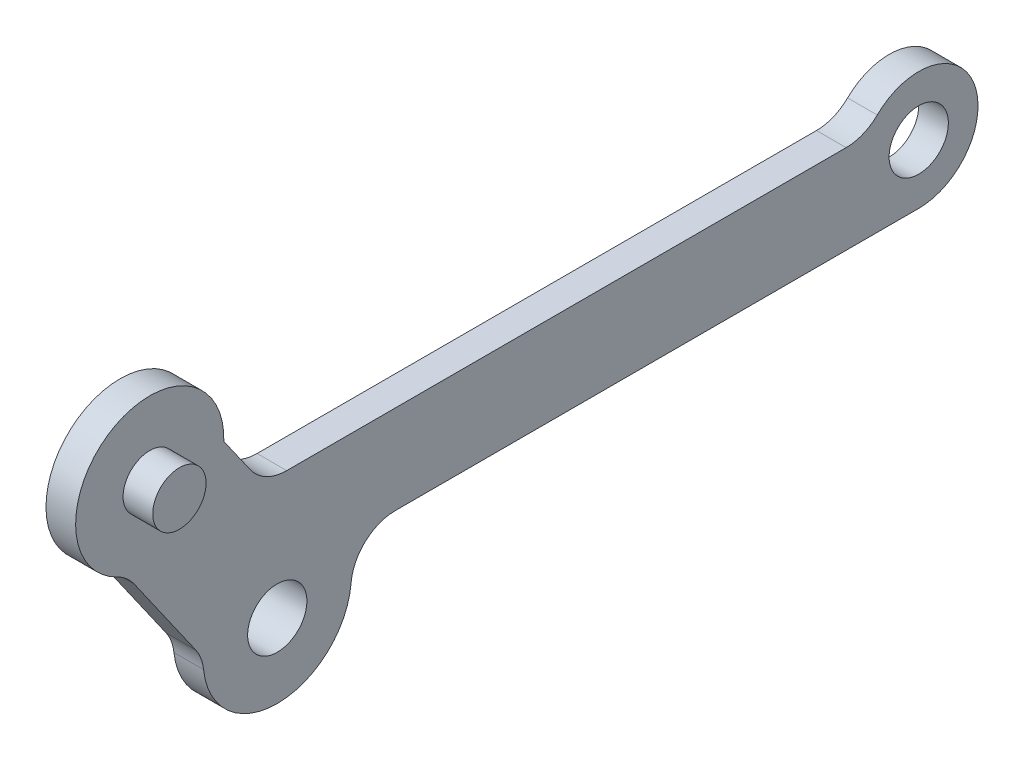
ISO-10303-21;
HEADER;
FILE_DESCRIPTION(('STEP AP214'),'2;1');
FILE_NAME('part.step','',(''),(''),'','','');
FILE_SCHEMA(('AUTOMOTIVE_DESIGN { 1 0 10303 214 1 1 1 1 }'));
ENDSEC;
DATA;
#1=APPLICATION_CONTEXT('core data for automotive mechanical design processes');
#2=APPLICATION_PROTOCOL_DEFINITION('international standard','automotive_design',2000,#1);
#3=PRODUCT_CONTEXT('',#1,'mechanical');
#4=PRODUCT('Part','Part','',(#3));
#5=PRODUCT_RELATED_PRODUCT_CATEGORY('part','',(#4));
#6=PRODUCT_DEFINITION_FORMATION('','',#4);
#7=PRODUCT_DEFINITION_CONTEXT('part definition',#1,'design');
#8=PRODUCT_DEFINITION('design','',#6,#7);
#9=PRODUCT_DEFINITION_SHAPE('','',#8);
#10=(LENGTH_UNIT() NAMED_UNIT(*) SI_UNIT(.MILLI.,.METRE.));
#11=(NAMED_UNIT(*) PLANE_ANGLE_UNIT() SI_UNIT($,.RADIAN.));
#12=(NAMED_UNIT(*) SI_UNIT($,.STERADIAN.) SOLID_ANGLE_UNIT());
#13=UNCERTAINTY_MEASURE_WITH_UNIT(LENGTH_MEASURE(1.E-05),#10,'distance_accuracy_value','');
#14=(GEOMETRIC_REPRESENTATION_CONTEXT(3) GLOBAL_UNCERTAINTY_ASSIGNED_CONTEXT((#13)) GLOBAL_UNIT_ASSIGNED_CONTEXT((#10,
#11,#12)) REPRESENTATION_CONTEXT('',''));
#15=CARTESIAN_POINT('',(0.,0.,0.));
#16=DIRECTION('',(0.,0.,1.));
#17=DIRECTION('',(1.,0.,0.));
#18=AXIS2_PLACEMENT_3D('',#15,#16,#17);
#19=CARTESIAN_POINT('',(2.,0.,0.));
#20=DIRECTION('',(0.,1.,0.));
#21=DIRECTION('',(0.,0.,1.));
#22=AXIS2_PLACEMENT_3D('',#19,#20,#21);
#23=PLANE('',#22);
#24=DIRECTION('',(0.,0.,-1.));
#25=VECTOR('',#24,1.);
#26=CARTESIAN_POINT('',(2.,0.,0.));
#27=LINE('',#26,#25);
#28=CARTESIAN_POINT('',(2.,0.,-1.56170115165524));
#29=VERTEX_POINT('',#28);
#30=CARTESIAN_POINT('',(2.,0.,-39.3022657436919));
#31=VERTEX_POINT('',#30);
#32=EDGE_CURVE('E237',#29,#31,#27,.T.);
#33=ORIENTED_EDGE('',*,*,#32,.T.);
#34=DIRECTION('',(-1.,0.,0.));
#35=VECTOR('',#34,1.);
#36=CARTESIAN_POINT('',(2.,0.,-39.3022657436919));
#37=LINE('',#36,#35);
#38=CARTESIAN_POINT('',(0.,0.,-39.3022657436919));
#39=VERTEX_POINT('',#38);
#40=EDGE_CURVE('E266',#31,#39,#37,.T.);
#41=ORIENTED_EDGE('',*,*,#40,.T.);
#42=DIRECTION('',(0.,0.,-1.));
#43=VECTOR('',#42,1.);
#44=CARTESIAN_POINT('',(0.,0.,0.));
#45=LINE('',#44,#43);
#46=CARTESIAN_POINT('',(0.,0.,-1.56170115165524));
#47=VERTEX_POINT('',#46);
#48=EDGE_CURVE('E263',#47,#39,#45,.T.);
#49=ORIENTED_EDGE('',*,*,#48,.F.);
#50=DIRECTION('',(-1.,0.,0.));
#51=VECTOR('',#50,1.);
#52=CARTESIAN_POINT('',(2.,0.,-1.56170115165524));
#53=LINE('',#52,#51);
#54=EDGE_CURVE('E246',#47,#29,#53,.F.);
#55=ORIENTED_EDGE('',*,*,#54,.T.);
#56=EDGE_LOOP('',(#33,#41,#49,#55));
#57=FACE_BOUND('',#56,.T.);
#58=ADVANCED_FACE('F136',(#57),#23,.T.);
#59=CARTESIAN_POINT('',(2.,-6.,0.));
#60=DIRECTION('',(0.,1.,0.));
#61=DIRECTION('',(0.,0.,1.));
#62=AXIS2_PLACEMENT_3D('',#59,#60,#61);
#63=PLANE('',#62);
#64=DIRECTION('',(0.,0.,-1.));
#65=VECTOR('',#64,1.);
#66=CARTESIAN_POINT('',(2.,-6.,0.));
#67=LINE('',#66,#65);
#68=CARTESIAN_POINT('',(2.,-6.,-8.89345099264765));
#69=VERTEX_POINT('',#68);
#70=CARTESIAN_POINT('',(2.,-6.,-44.2012452292583));
#71=VERTEX_POINT('',#70);
#72=EDGE_CURVE('E224',#69,#71,#67,.T.);
#73=ORIENTED_EDGE('',*,*,#72,.F.);
#74=DIRECTION('',(1.,0.,0.));
#75=VECTOR('',#74,1.);
#76=CARTESIAN_POINT('',(0.,-6.,-8.89345099264765));
#77=LINE('',#76,#75);
#78=CARTESIAN_POINT('',(0.,-6.,-8.89345099264765));
#79=VERTEX_POINT('',#78);
#80=EDGE_CURVE('E282',#69,#79,#77,.F.);
#81=ORIENTED_EDGE('',*,*,#80,.T.);
#82=DIRECTION('',(0.,0.,-1.));
#83=VECTOR('',#82,1.);
#84=CARTESIAN_POINT('',(0.,-6.,0.));
#85=LINE('',#84,#83);
#86=CARTESIAN_POINT('',(0.,-6.,-44.2012452292583));
#87=VERTEX_POINT('',#86);
#88=EDGE_CURVE('E242',#79,#87,#85,.T.);
#89=ORIENTED_EDGE('',*,*,#88,.T.);
#90=DIRECTION('',(-1.,0.,0.));
#91=VECTOR('',#90,1.);
#92=CARTESIAN_POINT('',(2.,-6.,-44.2012452292583));
#93=LINE('',#92,#91);
#94=EDGE_CURVE('E236',#71,#87,#93,.T.);
#95=ORIENTED_EDGE('',*,*,#94,.F.);
#96=EDGE_LOOP('',(#73,#81,#89,#95));
#97=FACE_BOUND('',#96,.T.);
#98=ADVANCED_FACE('F240',(#97),#63,.F.);
#99=CARTESIAN_POINT('',(0.,0.,0.));
#100=DIRECTION('',(1.,0.,0.));
#101=DIRECTION('',(0.,0.,-1.));
#102=AXIS2_PLACEMENT_3D('',#99,#100,#101);
#103=PLANE('',#102);
#104=CARTESIAN_POINT('',(0.,-2.,-44.2012452292583));
#105=DIRECTION('',(1.,0.,0.));
#106=DIRECTION('',(0.,0.,-1.));
#107=AXIS2_PLACEMENT_3D('',#104,#105,#106);
#108=CIRCLE('',#107,2.);
#109=CARTESIAN_POINT('',(0.,-2.,-46.2012452292583));
#110=VERTEX_POINT('',#109);
#111=EDGE_CURVE('E498',#110,#110,#108,.F.);
#112=ORIENTED_EDGE('',*,*,#111,.F.);
#113=EDGE_LOOP('',(#112));
#114=FACE_BOUND('',#113,.T.);
#115=CARTESIAN_POINT('',(0.,-8.29430574540418,-0.924637052102279));
#116=DIRECTION('',(1.,0.,0.));
#117=DIRECTION('',(0.,0.,-1.));
#118=AXIS2_PLACEMENT_3D('',#115,#116,#117);
#119=CIRCLE('',#118,3.);
#120=CARTESIAN_POINT('',(0.,-8.29430574540418,-3.92463705210228));
#121=VERTEX_POINT('',#120);
#122=EDGE_CURVE('E495',#121,#121,#119,.T.);
#123=ORIENTED_EDGE('',*,*,#122,.T.);
#124=EDGE_LOOP('',(#123));
#125=FACE_BOUND('',#124,.T.);
#126=DIRECTION('',(0.,-0.819152044288992,-0.573576436351045));
#127=VECTOR('',#126,1.);
#128=CARTESIAN_POINT('',(0.,6.28728066433489,4.40240131600742));
#129=LINE('',#128,#127);
#130=CARTESIAN_POINT('',(0.,3.82982453146792,2.6816720069543));
#131=VERTEX_POINT('',#130);
#132=CARTESIAN_POINT('',(0.,1.27927069094687,0.895754981211733));
#133=VERTEX_POINT('',#132);
#134=EDGE_CURVE('E307',#131,#133,#129,.T.);
#135=ORIENTED_EDGE('',*,*,#134,.T.);
#136=CARTESIAN_POINT('',(0.,3.,-1.56170115165524));
#137=DIRECTION('',(1.,0.,0.));
#138=DIRECTION('',(0.,0.,-1.));
#139=AXIS2_PLACEMENT_3D('',#136,#137,#138);
#140=CIRCLE('',#139,3.);
#141=EDGE_CURVE('E144',#133,#47,#140,.T.);
#142=ORIENTED_EDGE('',*,*,#141,.T.);
#143=ORIENTED_EDGE('',*,*,#48,.T.);
#144=CARTESIAN_POINT('',(0.,3.,-39.3022657436919));
#145=DIRECTION('',(1.,0.,0.));
#146=DIRECTION('',(0.,0.,-1.));
#147=AXIS2_PLACEMENT_3D('',#144,#145,#146);
#148=CIRCLE('',#147,3.);
#149=CARTESIAN_POINT('',(0.,0.857142857142855,-41.4018283803632));
#150=VERTEX_POINT('',#149);
#151=EDGE_CURVE('E286',#39,#150,#148,.T.);
#152=ORIENTED_EDGE('',*,*,#151,.T.);
#153=CARTESIAN_POINT('',(0.,-2.,-44.2012452292583));
#154=DIRECTION('',(1.,0.,0.));
#155=DIRECTION('',(0.,0.,-1.));
#156=AXIS2_PLACEMENT_3D('',#153,#154,#155);
#157=CIRCLE('',#156,3.99999999999999);
#158=EDGE_CURVE('E252',#87,#150,#157,.T.);
#159=ORIENTED_EDGE('',*,*,#158,.F.);
#160=ORIENTED_EDGE('',*,*,#88,.F.);
#161=CARTESIAN_POINT('',(0.,-9.,-8.89345099264765));
#162=DIRECTION('',(1.,0.,0.));
#163=DIRECTION('',(0.,0.,-1.));
#164=AXIS2_PLACEMENT_3D('',#161,#162,#163);
#165=CIRCLE('',#164,3.);
#166=CARTESIAN_POINT('',(0.,-8.73536465452657,-5.90514576494314));
#167=VERTEX_POINT('',#166);
#168=EDGE_CURVE('E298',#79,#167,#165,.T.);
#169=ORIENTED_EDGE('',*,*,#168,.T.);
#170=CARTESIAN_POINT('',(0.,-8.29430574540418,-0.924637052102279));
#171=DIRECTION('',(1.,0.,0.));
#172=DIRECTION('',(0.,0.,-1.));
#173=AXIS2_PLACEMENT_3D('',#170,#171,#172);
#174=CIRCLE('',#173,4.99999999999999);
#175=CARTESIAN_POINT('',(0.,-8.82085126347562,4.04756063276493));
#176=VERTEX_POINT('',#175);
#177=EDGE_CURVE('E251',#176,#167,#174,.T.);
#178=ORIENTED_EDGE('',*,*,#177,.F.);
#179=CARTESIAN_POINT('',(0.,-9.13677857431849,7.03087924368525));
#180=DIRECTION('',(1.,0.,0.));
#181=DIRECTION('',(0.,0.,-1.));
#182=AXIS2_PLACEMENT_3D('',#179,#180,#181);
#183=CIRCLE('',#182,3.);
#184=CARTESIAN_POINT('',(0.,-7.41604926526535,4.57342311081828));
#185=VERTEX_POINT('',#184);
#186=EDGE_CURVE('E290',#176,#185,#183,.T.);
#187=ORIENTED_EDGE('',*,*,#186,.T.);
#188=DIRECTION('',(0.,-0.819152044288993,-0.573576436351045));
#189=VECTOR('',#188,1.);
#190=CARTESIAN_POINT('',(0.,1.69866917352653,10.9556176703194));
#191=LINE('',#190,#189);
#192=CARTESIAN_POINT('',(0.,-1.47389305201649,8.73416568455478));
#193=VERTEX_POINT('',#192);
#194=EDGE_CURVE('E318',#193,#185,#191,.T.);
#195=ORIENTED_EDGE('',*,*,#194,.F.);
#196=CARTESIAN_POINT('',(0.,-3.19462236106962,11.1916218174218));
#197=DIRECTION('',(1.,0.,0.));
#198=DIRECTION('',(0.,0.,-1.));
#199=AXIS2_PLACEMENT_3D('',#196,#197,#198);
#200=CIRCLE('',#199,3.);
#201=CARTESIAN_POINT('',(0.,-0.499273381069496,9.87439219582487));
#202=VERTEX_POINT('',#201);
#203=EDGE_CURVE('E294',#193,#202,#200,.T.);
#204=ORIENTED_EDGE('',*,*,#203,.T.);
#205=CARTESIAN_POINT('',(0.,3.99297491893071,7.67900949316339));
#206=DIRECTION('',(1.,0.,0.));
#207=DIRECTION('',(0.,0.,-1.));
#208=AXIS2_PLACEMENT_3D('',#205,#206,#207);
#209=CIRCLE('',#208,4.99999999999999);
#210=EDGE_CURVE('E321',#131,#202,#209,.T.);
#211=ORIENTED_EDGE('',*,*,#210,.F.);
#212=EDGE_LOOP('',(#135,#142,#143,#152,#159,#160,#169,#178,#187,#195,#204,#211));
#213=FACE_BOUND('',#212,.T.);
#214=ADVANCED_FACE('F304',(#114,#125,#213),#103,.F.);
#215=CARTESIAN_POINT('',(2.,0.,0.));
#216=DIRECTION('',(1.,0.,0.));
#217=DIRECTION('',(0.,0.,-1.));
#218=AXIS2_PLACEMENT_3D('',#215,#216,#217);
#219=PLANE('',#218);
#220=CARTESIAN_POINT('',(2.,3.99297491893071,7.67900949316339));
#221=DIRECTION('',(1.,0.,0.));
#222=DIRECTION('',(0.,0.,-1.));
#223=AXIS2_PLACEMENT_3D('',#220,#221,#222);
#224=CIRCLE('',#223,1.8);
#225=CARTESIAN_POINT('',(2.,3.99297491893071,5.87900949316339));
#226=VERTEX_POINT('',#225);
#227=EDGE_CURVE('E511',#226,#226,#224,.T.);
#228=ORIENTED_EDGE('',*,*,#227,.F.);
#229=EDGE_LOOP('',(#228));
#230=FACE_BOUND('',#229,.T.);
#231=CARTESIAN_POINT('',(2.,-8.29430574540418,-0.924637052102279));
#232=DIRECTION('',(1.,0.,0.));
#233=DIRECTION('',(0.,0.,-1.));
#234=AXIS2_PLACEMENT_3D('',#231,#232,#233);
#235=CIRCLE('',#234,2.);
#236=CARTESIAN_POINT('',(2.,-8.29430574540418,-2.92463705210228));
#237=VERTEX_POINT('',#236);
#238=EDGE_CURVE('E506',#237,#237,#235,.T.);
#239=ORIENTED_EDGE('',*,*,#238,.F.);
#240=EDGE_LOOP('',(#239));
#241=FACE_BOUND('',#240,.T.);
#242=CARTESIAN_POINT('',(2.,-2.,-44.2012452292583));
#243=DIRECTION('',(1.,0.,0.));
#244=DIRECTION('',(0.,0.,-1.));
#245=AXIS2_PLACEMENT_3D('',#242,#243,#244);
#246=CIRCLE('',#245,2.);
#247=CARTESIAN_POINT('',(2.,-2.,-46.2012452292583));
#248=VERTEX_POINT('',#247);
#249=EDGE_CURVE('E503',#248,#248,#246,.T.);
#250=ORIENTED_EDGE('',*,*,#249,.F.);
#251=EDGE_LOOP('',(#250));
#252=FACE_BOUND('',#251,.T.);
#253=CARTESIAN_POINT('',(2.,-8.29430574540418,-0.924637052102279));
#254=DIRECTION('',(1.,0.,0.));
#255=DIRECTION('',(0.,0.,-1.));
#256=AXIS2_PLACEMENT_3D('',#253,#254,#255);
#257=CIRCLE('',#256,4.99999999999999);
#258=CARTESIAN_POINT('',(2.,-8.82085126347562,4.04756063276493));
#259=VERTEX_POINT('',#258);
#260=CARTESIAN_POINT('',(2.,-8.73536465452657,-5.90514576494314));
#261=VERTEX_POINT('',#260);
#262=EDGE_CURVE('E255',#259,#261,#257,.T.);
#263=ORIENTED_EDGE('',*,*,#262,.T.);
#264=CARTESIAN_POINT('',(2.,-9.,-8.89345099264765));
#265=DIRECTION('',(1.,0.,0.));
#266=DIRECTION('',(0.,0.,-1.));
#267=AXIS2_PLACEMENT_3D('',#264,#265,#266);
#268=CIRCLE('',#267,3.);
#269=EDGE_CURVE('E232',#261,#69,#268,.F.);
#270=ORIENTED_EDGE('',*,*,#269,.T.);
#271=ORIENTED_EDGE('',*,*,#72,.T.);
#272=CARTESIAN_POINT('',(2.,-2.,-44.2012452292583));
#273=DIRECTION('',(1.,0.,0.));
#274=DIRECTION('',(0.,0.,-1.));
#275=AXIS2_PLACEMENT_3D('',#272,#273,#274);
#276=CIRCLE('',#275,3.99999999999999);
#277=CARTESIAN_POINT('',(2.,0.857142857142855,-41.4018283803632));
#278=VERTEX_POINT('',#277);
#279=EDGE_CURVE('E229',#71,#278,#276,.T.);
#280=ORIENTED_EDGE('',*,*,#279,.T.);
#281=CARTESIAN_POINT('',(2.,3.,-39.3022657436919));
#282=DIRECTION('',(1.,0.,0.));
#283=DIRECTION('',(0.,0.,-1.));
#284=AXIS2_PLACEMENT_3D('',#281,#282,#283);
#285=CIRCLE('',#284,3.);
#286=EDGE_CURVE('E288',#278,#31,#285,.F.);
#287=ORIENTED_EDGE('',*,*,#286,.T.);
#288=ORIENTED_EDGE('',*,*,#32,.F.);
#289=CARTESIAN_POINT('',(2.,3.,-1.56170115165524));
#290=DIRECTION('',(1.,0.,0.));
#291=DIRECTION('',(0.,0.,-1.));
#292=AXIS2_PLACEMENT_3D('',#289,#290,#291);
#293=CIRCLE('',#292,3.);
#294=CARTESIAN_POINT('',(2.,1.27927069094687,0.895754981211733));
#295=VERTEX_POINT('',#294);
#296=EDGE_CURVE('E12',#29,#295,#293,.F.);
#297=ORIENTED_EDGE('',*,*,#296,.T.);
#298=DIRECTION('',(0.,-0.819152044288992,-0.573576436351045));
#299=VECTOR('',#298,1.);
#300=CARTESIAN_POINT('',(2.,6.28728066433489,4.40240131600742));
#301=LINE('',#300,#299);
#302=CARTESIAN_POINT('',(2.,3.82982453146792,2.6816720069543));
#303=VERTEX_POINT('',#302);
#304=EDGE_CURVE('E314',#303,#295,#301,.T.);
#305=ORIENTED_EDGE('',*,*,#304,.F.);
#306=CARTESIAN_POINT('',(2.,3.99297491893071,7.67900949316339));
#307=DIRECTION('',(1.,0.,0.));
#308=DIRECTION('',(0.,0.,-1.));
#309=AXIS2_PLACEMENT_3D('',#306,#307,#308);
#310=CIRCLE('',#309,4.99999999999999);
#311=CARTESIAN_POINT('',(2.,-0.499273381069496,9.87439219582487));
#312=VERTEX_POINT('',#311);
#313=EDGE_CURVE('E264',#303,#312,#310,.T.);
#314=ORIENTED_EDGE('',*,*,#313,.T.);
#315=CARTESIAN_POINT('',(2.,-3.19462236106962,11.1916218174218));
#316=DIRECTION('',(1.,0.,0.));
#317=DIRECTION('',(0.,0.,-1.));
#318=AXIS2_PLACEMENT_3D('',#315,#316,#317);
#319=CIRCLE('',#318,3.);
#320=CARTESIAN_POINT('',(2.,-1.47389305201649,8.73416568455478));
#321=VERTEX_POINT('',#320);
#322=EDGE_CURVE('E296',#312,#321,#319,.F.);
#323=ORIENTED_EDGE('',*,*,#322,.T.);
#324=DIRECTION('',(0.,-0.819152044288993,-0.573576436351045));
#325=VECTOR('',#324,1.);
#326=CARTESIAN_POINT('',(2.,1.69866917352653,10.9556176703194));
#327=LINE('',#326,#325);
#328=CARTESIAN_POINT('',(2.,-7.41604926526535,4.57342311081828));
#329=VERTEX_POINT('',#328);
#330=EDGE_CURVE('E317',#321,#329,#327,.T.);
#331=ORIENTED_EDGE('',*,*,#330,.T.);
#332=CARTESIAN_POINT('',(2.,-9.13677857431849,7.03087924368525));
#333=DIRECTION('',(1.,0.,0.));
#334=DIRECTION('',(0.,0.,-1.));
#335=AXIS2_PLACEMENT_3D('',#332,#333,#334);
#336=CIRCLE('',#335,3.);
#337=EDGE_CURVE('E292',#329,#259,#336,.F.);
#338=ORIENTED_EDGE('',*,*,#337,.T.);
#339=EDGE_LOOP('',(#263,#270,#271,#280,#287,#288,#297,#305,#314,#323,#331,#338));
#340=FACE_BOUND('',#339,.T.);
#341=ADVANCED_FACE('F227',(#230,#241,#252,#340),#219,.T.);
#342=CARTESIAN_POINT('',(2.,-2.,-44.2012452292583));
#343=DIRECTION('',(-1.,0.,0.));
#344=DIRECTION('',(0.,0.,1.));
#345=AXIS2_PLACEMENT_3D('',#342,#343,#344);
#346=CYLINDRICAL_SURFACE('',#345,3.99999999999999);
#347=ORIENTED_EDGE('',*,*,#158,.T.);
#348=DIRECTION('',(-1.,0.,0.));
#349=VECTOR('',#348,1.);
#350=CARTESIAN_POINT('',(2.,0.857142857142855,-41.4018283803632));
#351=LINE('',#350,#349);
#352=EDGE_CURVE('E250',#150,#278,#351,.F.);
#353=ORIENTED_EDGE('',*,*,#352,.T.);
#354=ORIENTED_EDGE('',*,*,#279,.F.);
#355=ORIENTED_EDGE('',*,*,#94,.T.);
#356=EDGE_LOOP('',(#347,#353,#354,#355));
#357=FACE_BOUND('',#356,.T.);
#358=ADVANCED_FACE('F248',(#357),#346,.T.);
#359=CARTESIAN_POINT('',(2.,3.99297491893071,7.67900949316339));
#360=DIRECTION('',(-1.,0.,0.));
#361=DIRECTION('',(0.,0.,1.));
#362=AXIS2_PLACEMENT_3D('',#359,#360,#361);
#363=CYLINDRICAL_SURFACE('',#362,4.99999999999999);
#364=ORIENTED_EDGE('',*,*,#210,.T.);
#365=DIRECTION('',(-1.,0.,0.));
#366=VECTOR('',#365,1.);
#367=CARTESIAN_POINT('',(2.,-0.499273381069497,9.87439219582487));
#368=LINE('',#367,#366);
#369=EDGE_CURVE('E280',#202,#312,#368,.F.);
#370=ORIENTED_EDGE('',*,*,#369,.T.);
#371=ORIENTED_EDGE('',*,*,#313,.F.);
#372=DIRECTION('',(-1.,0.,0.));
#373=VECTOR('',#372,1.);
#374=CARTESIAN_POINT('',(2.,3.82982453146792,2.6816720069543));
#375=LINE('',#374,#373);
#376=EDGE_CURVE('E261',#303,#131,#375,.T.);
#377=ORIENTED_EDGE('',*,*,#376,.T.);
#378=EDGE_LOOP('',(#364,#370,#371,#377));
#379=FACE_BOUND('',#378,.T.);
#380=ADVANCED_FACE('F342',(#379),#363,.T.);
#381=CARTESIAN_POINT('',(2.,6.28728066433489,4.40240131600742));
#382=DIRECTION('',(0.,0.573576436351045,-0.819152044288992));
#383=DIRECTION('',(0.,0.819152044288993,0.573576436351045));
#384=AXIS2_PLACEMENT_3D('',#381,#382,#383);
#385=PLANE('',#384);
#386=ORIENTED_EDGE('',*,*,#304,.T.);
#387=DIRECTION('',(-1.,0.,0.));
#388=VECTOR('',#387,1.);
#389=CARTESIAN_POINT('',(0.,1.27927069094686,0.895754981211733));
#390=LINE('',#389,#388);
#391=EDGE_CURVE('E284',#295,#133,#390,.T.);
#392=ORIENTED_EDGE('',*,*,#391,.T.);
#393=ORIENTED_EDGE('',*,*,#134,.F.);
#394=ORIENTED_EDGE('',*,*,#376,.F.);
#395=EDGE_LOOP('',(#386,#392,#393,#394));
#396=FACE_BOUND('',#395,.T.);
#397=ADVANCED_FACE('F313',(#396),#385,.T.);
#398=CARTESIAN_POINT('',(2.,1.69866917352653,10.9556176703194));
#399=DIRECTION('',(0.,0.573576436351045,-0.819152044288993));
#400=DIRECTION('',(0.,0.819152044288993,0.573576436351045));
#401=AXIS2_PLACEMENT_3D('',#398,#399,#400);
#402=PLANE('',#401);
#403=ORIENTED_EDGE('',*,*,#194,.T.);
#404=DIRECTION('',(1.,0.,0.));
#405=VECTOR('',#404,1.);
#406=CARTESIAN_POINT('',(2.,-7.41604926526535,4.57342311081828));
#407=LINE('',#406,#405);
#408=EDGE_CURVE('E278',#185,#329,#407,.T.);
#409=ORIENTED_EDGE('',*,*,#408,.T.);
#410=ORIENTED_EDGE('',*,*,#330,.F.);
#411=DIRECTION('',(1.,0.,0.));
#412=VECTOR('',#411,1.);
#413=CARTESIAN_POINT('',(0.,-1.47389305201649,8.73416568455478));
#414=LINE('',#413,#412);
#415=EDGE_CURVE('E275',#321,#193,#414,.F.);
#416=ORIENTED_EDGE('',*,*,#415,.T.);
#417=EDGE_LOOP('',(#403,#409,#410,#416));
#418=FACE_BOUND('',#417,.T.);
#419=ADVANCED_FACE('F348',(#418),#402,.F.);
#420=CARTESIAN_POINT('',(2.,-8.29430574540418,-0.924637052102279));
#421=DIRECTION('',(-1.,0.,0.));
#422=DIRECTION('',(0.,0.,1.));
#423=AXIS2_PLACEMENT_3D('',#420,#421,#422);
#424=CYLINDRICAL_SURFACE('',#423,4.99999999999999);
#425=ORIENTED_EDGE('',*,*,#262,.F.);
#426=DIRECTION('',(-1.,0.,0.));
#427=VECTOR('',#426,1.);
#428=CARTESIAN_POINT('',(2.,-8.82085126347562,4.04756063276493));
#429=LINE('',#428,#427);
#430=EDGE_CURVE('E272',#259,#176,#429,.T.);
#431=ORIENTED_EDGE('',*,*,#430,.T.);
#432=ORIENTED_EDGE('',*,*,#177,.T.);
#433=DIRECTION('',(-1.,0.,0.));
#434=VECTOR('',#433,1.);
#435=CARTESIAN_POINT('',(2.,-8.73536465452657,-5.90514576494314));
#436=LINE('',#435,#434);
#437=EDGE_CURVE('E270',#167,#261,#436,.F.);
#438=ORIENTED_EDGE('',*,*,#437,.T.);
#439=EDGE_LOOP('',(#425,#431,#432,#438));
#440=FACE_BOUND('',#439,.T.);
#441=ADVANCED_FACE('F353',(#440),#424,.T.);
#442=CARTESIAN_POINT('',(-2.,-8.29430574540418,-0.924637052102279));
#443=DIRECTION('',(1.,0.,0.));
#444=DIRECTION('',(0.,0.,-1.));
#445=AXIS2_PLACEMENT_3D('',#442,#443,#444);
#446=CYLINDRICAL_SURFACE('',#445,3.);
#447=CARTESIAN_POINT('',(-2.,-8.29430574540418,-0.924637052102279));
#448=DIRECTION('',(1.,0.,0.));
#449=DIRECTION('',(0.,0.,-1.));
#450=AXIS2_PLACEMENT_3D('',#447,#448,#449);
#451=CIRCLE('',#450,3.);
#452=CARTESIAN_POINT('',(-2.,-8.29430574540418,-3.92463705210228));
#453=VERTEX_POINT('',#452);
#454=EDGE_CURVE('E257',#453,#453,#451,.T.);
#455=ORIENTED_EDGE('',*,*,#454,.T.);
#456=EDGE_LOOP('',(#455));
#457=FACE_BOUND('',#456,.T.);
#458=ORIENTED_EDGE('',*,*,#122,.F.);
#459=EDGE_LOOP('',(#458));
#460=FACE_BOUND('',#459,.T.);
#461=ADVANCED_FACE('F355',(#457,#460),#446,.T.);
#462=CARTESIAN_POINT('',(-2.,-8.29430574540418,-0.924637052102279));
#463=DIRECTION('',(1.,0.,0.));
#464=DIRECTION('',(0.,0.,-1.));
#465=AXIS2_PLACEMENT_3D('',#462,#463,#464);
#466=PLANE('',#465);
#467=CARTESIAN_POINT('',(-2.,-8.29430574540418,-0.924637052102279));
#468=DIRECTION('',(1.,0.,0.));
#469=DIRECTION('',(0.,0.,-1.));
#470=AXIS2_PLACEMENT_3D('',#467,#468,#469);
#471=CIRCLE('',#470,2.);
#472=CARTESIAN_POINT('',(-2.,-8.29430574540418,-2.92463705210228));
#473=VERTEX_POINT('',#472);
#474=EDGE_CURVE('E492',#473,#473,#471,.T.);
#475=ORIENTED_EDGE('',*,*,#474,.T.);
#476=EDGE_LOOP('',(#475));
#477=FACE_BOUND('',#476,.T.);
#478=ORIENTED_EDGE('',*,*,#454,.F.);
#479=EDGE_LOOP('',(#478));
#480=FACE_BOUND('',#479,.T.);
#481=ADVANCED_FACE('F361',(#477,#480),#466,.F.);
#482=CARTESIAN_POINT('',(2.,-8.29430574540418,-0.924637052102279));
#483=DIRECTION('',(-1.,0.,0.));
#484=DIRECTION('',(0.,0.,1.));
#485=AXIS2_PLACEMENT_3D('',#482,#483,#484);
#486=CYLINDRICAL_SURFACE('',#485,2.);
#487=ORIENTED_EDGE('',*,*,#238,.T.);
#488=EDGE_LOOP('',(#487));
#489=FACE_BOUND('',#488,.T.);
#490=ORIENTED_EDGE('',*,*,#474,.F.);
#491=EDGE_LOOP('',(#490));
#492=FACE_BOUND('',#491,.T.);
#493=ADVANCED_FACE('F479',(#489,#492),#486,.F.);
#494=CARTESIAN_POINT('',(2.,-2.,-44.2012452292583));
#495=DIRECTION('',(-1.,0.,0.));
#496=DIRECTION('',(0.,0.,1.));
#497=AXIS2_PLACEMENT_3D('',#494,#495,#496);
#498=CYLINDRICAL_SURFACE('',#497,2.);
#499=ORIENTED_EDGE('',*,*,#249,.T.);
#500=EDGE_LOOP('',(#499));
#501=FACE_BOUND('',#500,.T.);
#502=ORIENTED_EDGE('',*,*,#111,.T.);
#503=EDGE_LOOP('',(#502));
#504=FACE_BOUND('',#503,.T.);
#505=ADVANCED_FACE('F401',(#501,#504),#498,.F.);
#506=CARTESIAN_POINT('',(2.,3.,-39.3022657436919));
#507=DIRECTION('',(-1.,0.,0.));
#508=DIRECTION('',(0.,0.,1.));
#509=AXIS2_PLACEMENT_3D('',#506,#507,#508);
#510=CYLINDRICAL_SURFACE('',#509,3.);
#511=ORIENTED_EDGE('',*,*,#286,.F.);
#512=ORIENTED_EDGE('',*,*,#352,.F.);
#513=ORIENTED_EDGE('',*,*,#151,.F.);
#514=ORIENTED_EDGE('',*,*,#40,.F.);
#515=EDGE_LOOP('',(#511,#512,#513,#514));
#516=FACE_BOUND('',#515,.T.);
#517=ADVANCED_FACE('F396',(#516),#510,.F.);
#518=CARTESIAN_POINT('',(2.,-9.13677857431849,7.03087924368525));
#519=DIRECTION('',(-1.,0.,0.));
#520=DIRECTION('',(0.,0.,1.));
#521=AXIS2_PLACEMENT_3D('',#518,#519,#520);
#522=CYLINDRICAL_SURFACE('',#521,3.);
#523=ORIENTED_EDGE('',*,*,#337,.F.);
#524=ORIENTED_EDGE('',*,*,#408,.F.);
#525=ORIENTED_EDGE('',*,*,#186,.F.);
#526=ORIENTED_EDGE('',*,*,#430,.F.);
#527=EDGE_LOOP('',(#523,#524,#525,#526));
#528=FACE_BOUND('',#527,.T.);
#529=ADVANCED_FACE('F352',(#528),#522,.F.);
#530=CARTESIAN_POINT('',(2.,-3.19462236106962,11.1916218174218));
#531=DIRECTION('',(-1.,0.,0.));
#532=DIRECTION('',(0.,0.,1.));
#533=AXIS2_PLACEMENT_3D('',#530,#531,#532);
#534=CYLINDRICAL_SURFACE('',#533,3.);
#535=ORIENTED_EDGE('',*,*,#322,.F.);
#536=ORIENTED_EDGE('',*,*,#369,.F.);
#537=ORIENTED_EDGE('',*,*,#203,.F.);
#538=ORIENTED_EDGE('',*,*,#415,.F.);
#539=EDGE_LOOP('',(#535,#536,#537,#538));
#540=FACE_BOUND('',#539,.T.);
#541=ADVANCED_FACE('F344',(#540),#534,.F.);
#542=CARTESIAN_POINT('',(2.,-9.,-8.89345099264765));
#543=DIRECTION('',(-1.,0.,0.));
#544=DIRECTION('',(0.,0.,1.));
#545=AXIS2_PLACEMENT_3D('',#542,#543,#544);
#546=CYLINDRICAL_SURFACE('',#545,3.);
#547=ORIENTED_EDGE('',*,*,#269,.F.);
#548=ORIENTED_EDGE('',*,*,#437,.F.);
#549=ORIENTED_EDGE('',*,*,#168,.F.);
#550=ORIENTED_EDGE('',*,*,#80,.F.);
#551=EDGE_LOOP('',(#547,#548,#549,#550));
#552=FACE_BOUND('',#551,.T.);
#553=ADVANCED_FACE('F334',(#552),#546,.F.);
#554=CARTESIAN_POINT('',(2.,3.,-1.56170115165524));
#555=DIRECTION('',(1.,0.,0.));
#556=DIRECTION('',(0.,0.,-1.));
#557=AXIS2_PLACEMENT_3D('',#554,#555,#556);
#558=CYLINDRICAL_SURFACE('',#557,3.);
#559=ORIENTED_EDGE('',*,*,#296,.F.);
#560=ORIENTED_EDGE('',*,*,#54,.F.);
#561=ORIENTED_EDGE('',*,*,#141,.F.);
#562=ORIENTED_EDGE('',*,*,#391,.F.);
#563=EDGE_LOOP('',(#559,#560,#561,#562));
#564=FACE_BOUND('',#563,.T.);
#565=ADVANCED_FACE('F138',(#564),#558,.F.);
#566=CARTESIAN_POINT('',(4.,3.99297491893071,7.67900949316339));
#567=DIRECTION('',(-1.,0.,0.));
#568=DIRECTION('',(0.,0.,1.));
#569=AXIS2_PLACEMENT_3D('',#566,#567,#568);
#570=CYLINDRICAL_SURFACE('',#569,1.8);
#571=CARTESIAN_POINT('',(4.,3.99297491893071,7.67900949316339));
#572=DIRECTION('',(1.,0.,0.));
#573=DIRECTION('',(0.,0.,-1.));
#574=AXIS2_PLACEMENT_3D('',#571,#572,#573);
#575=CIRCLE('',#574,1.8);
#576=CARTESIAN_POINT('',(4.,3.99297491893071,5.87900949316339));
#577=VERTEX_POINT('',#576);
#578=EDGE_CURVE('E507',#577,#577,#575,.T.);
#579=ORIENTED_EDGE('',*,*,#578,.F.);
#580=EDGE_LOOP('',(#579));
#581=FACE_BOUND('',#580,.T.);
#582=ORIENTED_EDGE('',*,*,#227,.T.);
#583=EDGE_LOOP('',(#582));
#584=FACE_BOUND('',#583,.T.);
#585=ADVANCED_FACE('F436',(#581,#584),#570,.T.);
#586=CARTESIAN_POINT('',(4.,0.,0.));
#587=DIRECTION('',(1.,0.,0.));
#588=DIRECTION('',(0.,0.,-1.));
#589=AXIS2_PLACEMENT_3D('',#586,#587,#588);
#590=PLANE('',#589);
#591=ORIENTED_EDGE('',*,*,#578,.T.);
#592=EDGE_LOOP('',(#591));
#593=FACE_BOUND('',#592,.T.);
#594=ADVANCED_FACE('F463',(#593),#590,.T.);
#595=CLOSED_SHELL('',(#58,#98,#214,#341,#358,#380,#397,#419,#441,#461,#481,#493,#505,#517,#529,
#541,#553,#565,#585,#594));
#596=MANIFOLD_SOLID_BREP('B2',#595);
#597=ADVANCED_BREP_SHAPE_REPRESENTATION('',(#18,#596),#14);
#598=SHAPE_DEFINITION_REPRESENTATION(#9,#597);
ENDSEC;
END-ISO-10303-21;
